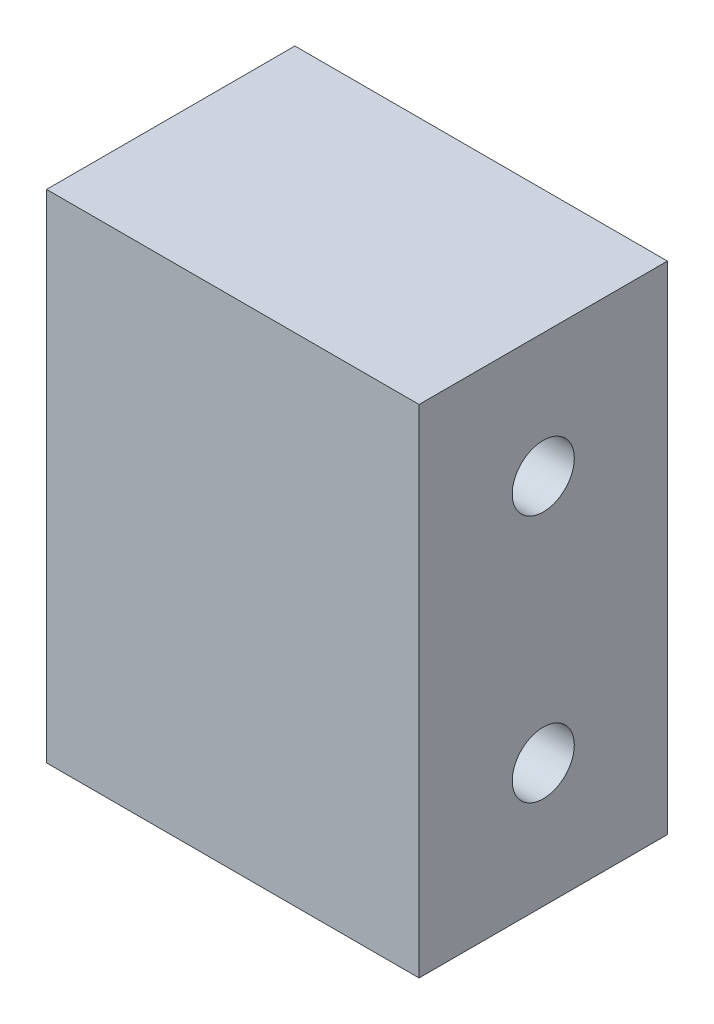
ISO-10303-21;
HEADER;
FILE_DESCRIPTION(('STEP AP214'),'2;1');
FILE_NAME('part.step','',(''),(''),'','','');
FILE_SCHEMA(('AUTOMOTIVE_DESIGN { 1 0 10303 214 1 1 1 1 }'));
ENDSEC;
DATA;
#1=APPLICATION_CONTEXT('core data for automotive mechanical design processes');
#2=APPLICATION_PROTOCOL_DEFINITION('international standard','automotive_design',2000,#1);
#3=PRODUCT_CONTEXT('',#1,'mechanical');
#4=PRODUCT('Part','Part','',(#3));
#5=PRODUCT_RELATED_PRODUCT_CATEGORY('part','',(#4));
#6=PRODUCT_DEFINITION_FORMATION('','',#4);
#7=PRODUCT_DEFINITION_CONTEXT('part definition',#1,'design');
#8=PRODUCT_DEFINITION('design','',#6,#7);
#9=PRODUCT_DEFINITION_SHAPE('','',#8);
#10=(LENGTH_UNIT() NAMED_UNIT(*) SI_UNIT(.MILLI.,.METRE.));
#11=(NAMED_UNIT(*) PLANE_ANGLE_UNIT() SI_UNIT($,.RADIAN.));
#12=(NAMED_UNIT(*) SI_UNIT($,.STERADIAN.) SOLID_ANGLE_UNIT());
#13=UNCERTAINTY_MEASURE_WITH_UNIT(LENGTH_MEASURE(1.E-05),#10,'distance_accuracy_value','');
#14=(GEOMETRIC_REPRESENTATION_CONTEXT(3) GLOBAL_UNCERTAINTY_ASSIGNED_CONTEXT((#13)) GLOBAL_UNIT_ASSIGNED_CONTEXT((#10,
#11,#12)) REPRESENTATION_CONTEXT('',''));
#15=CARTESIAN_POINT('',(0.,0.,0.));
#16=DIRECTION('',(0.,0.,1.));
#17=DIRECTION('',(1.,0.,0.));
#18=AXIS2_PLACEMENT_3D('',#15,#16,#17);
#19=CARTESIAN_POINT('',(60.,0.,0.));
#20=DIRECTION('',(-1.,0.,0.));
#21=DIRECTION('',(0.,0.,1.));
#22=AXIS2_PLACEMENT_3D('',#19,#20,#21);
#23=PLANE('',#22);
#24=DIRECTION('',(0.,-1.,0.));
#25=VECTOR('',#24,1.);
#26=CARTESIAN_POINT('',(60.,0.,0.));
#27=LINE('',#26,#25);
#28=CARTESIAN_POINT('',(60.,80.,0.));
#29=VERTEX_POINT('',#28);
#30=CARTESIAN_POINT('',(60.,0.,0.));
#31=VERTEX_POINT('',#30);
#32=EDGE_CURVE('E97',#29,#31,#27,.T.);
#33=ORIENTED_EDGE('',*,*,#32,.T.);
#34=DIRECTION('',(0.,0.,-1.));
#35=VECTOR('',#34,1.);
#36=CARTESIAN_POINT('',(60.,0.,0.));
#37=LINE('',#36,#35);
#38=CARTESIAN_POINT('',(60.,0.,-40.));
#39=VERTEX_POINT('',#38);
#40=EDGE_CURVE('E92',#31,#39,#37,.T.);
#41=ORIENTED_EDGE('',*,*,#40,.T.);
#42=DIRECTION('',(0.,1.,0.));
#43=VECTOR('',#42,1.);
#44=CARTESIAN_POINT('',(60.,0.,-40.));
#45=LINE('',#44,#43);
#46=CARTESIAN_POINT('',(60.,80.,-40.));
#47=VERTEX_POINT('',#46);
#48=EDGE_CURVE('E95',#39,#47,#45,.T.);
#49=ORIENTED_EDGE('',*,*,#48,.T.);
#50=DIRECTION('',(0.,0.,1.));
#51=VECTOR('',#50,1.);
#52=CARTESIAN_POINT('',(60.,80.,0.));
#53=LINE('',#52,#51);
#54=EDGE_CURVE('E62',#47,#29,#53,.T.);
#55=ORIENTED_EDGE('',*,*,#54,.T.);
#56=EDGE_LOOP('',(#33,#41,#49,#55));
#57=FACE_BOUND('',#56,.T.);
#58=CARTESIAN_POINT('',(60.,60.,-20.));
#59=DIRECTION('',(1.,0.,0.));
#60=DIRECTION('',(0.,0.,-1.));
#61=AXIS2_PLACEMENT_3D('',#58,#59,#60);
#62=CIRCLE('',#61,5.);
#63=CARTESIAN_POINT('',(60.,60.,-25.));
#64=VERTEX_POINT('',#63);
#65=EDGE_CURVE('E112',#64,#64,#62,.T.);
#66=ORIENTED_EDGE('',*,*,#65,.F.);
#67=EDGE_LOOP('',(#66));
#68=FACE_BOUND('',#67,.T.);
#69=CARTESIAN_POINT('',(60.,20.,-20.));
#70=DIRECTION('',(1.,0.,0.));
#71=DIRECTION('',(0.,0.,-1.));
#72=AXIS2_PLACEMENT_3D('',#69,#70,#71);
#73=CIRCLE('',#72,5.);
#74=CARTESIAN_POINT('',(60.,20.,-25.));
#75=VERTEX_POINT('',#74);
#76=EDGE_CURVE('E127',#75,#75,#73,.T.);
#77=ORIENTED_EDGE('',*,*,#76,.F.);
#78=EDGE_LOOP('',(#77));
#79=FACE_BOUND('',#78,.T.);
#80=ADVANCED_FACE('F45',(#57,#68,#79),#23,.F.);
#81=CARTESIAN_POINT('',(0.,0.,0.));
#82=DIRECTION('',(-1.,0.,0.));
#83=DIRECTION('',(0.,0.,1.));
#84=AXIS2_PLACEMENT_3D('',#81,#82,#83);
#85=PLANE('',#84);
#86=CARTESIAN_POINT('',(0.,60.,-20.));
#87=DIRECTION('',(1.,0.,0.));
#88=DIRECTION('',(0.,0.,-1.));
#89=AXIS2_PLACEMENT_3D('',#86,#87,#88);
#90=CIRCLE('',#89,5.);
#91=CARTESIAN_POINT('',(0.,60.,-25.));
#92=VERTEX_POINT('',#91);
#93=EDGE_CURVE('E124',#92,#92,#90,.T.);
#94=ORIENTED_EDGE('',*,*,#93,.T.);
#95=EDGE_LOOP('',(#94));
#96=FACE_BOUND('',#95,.T.);
#97=DIRECTION('',(0.,-1.,0.));
#98=VECTOR('',#97,1.);
#99=CARTESIAN_POINT('',(0.,0.,0.));
#100=LINE('',#99,#98);
#101=CARTESIAN_POINT('',(0.,80.,0.));
#102=VERTEX_POINT('',#101);
#103=CARTESIAN_POINT('',(0.,0.,0.));
#104=VERTEX_POINT('',#103);
#105=EDGE_CURVE('E109',#102,#104,#100,.T.);
#106=ORIENTED_EDGE('',*,*,#105,.F.);
#107=DIRECTION('',(0.,0.,1.));
#108=VECTOR('',#107,1.);
#109=CARTESIAN_POINT('',(0.,80.,0.));
#110=LINE('',#109,#108);
#111=CARTESIAN_POINT('',(0.,80.,-40.));
#112=VERTEX_POINT('',#111);
#113=EDGE_CURVE('E85',#112,#102,#110,.T.);
#114=ORIENTED_EDGE('',*,*,#113,.F.);
#115=DIRECTION('',(0.,1.,0.));
#116=VECTOR('',#115,1.);
#117=CARTESIAN_POINT('',(0.,0.,-40.));
#118=LINE('',#117,#116);
#119=CARTESIAN_POINT('',(0.,0.,-40.));
#120=VERTEX_POINT('',#119);
#121=EDGE_CURVE('E79',#120,#112,#118,.T.);
#122=ORIENTED_EDGE('',*,*,#121,.F.);
#123=DIRECTION('',(0.,0.,-1.));
#124=VECTOR('',#123,1.);
#125=CARTESIAN_POINT('',(0.,0.,0.));
#126=LINE('',#125,#124);
#127=EDGE_CURVE('E101',#104,#120,#126,.T.);
#128=ORIENTED_EDGE('',*,*,#127,.F.);
#129=EDGE_LOOP('',(#106,#114,#122,#128));
#130=FACE_BOUND('',#129,.T.);
#131=CARTESIAN_POINT('',(0.,20.,-20.));
#132=DIRECTION('',(1.,0.,0.));
#133=DIRECTION('',(0.,0.,-1.));
#134=AXIS2_PLACEMENT_3D('',#131,#132,#133);
#135=CIRCLE('',#134,5.);
#136=CARTESIAN_POINT('',(0.,20.,-25.));
#137=VERTEX_POINT('',#136);
#138=EDGE_CURVE('E130',#137,#137,#135,.T.);
#139=ORIENTED_EDGE('',*,*,#138,.T.);
#140=EDGE_LOOP('',(#139));
#141=FACE_BOUND('',#140,.T.);
#142=ADVANCED_FACE('F120',(#96,#130,#141),#85,.T.);
#143=CARTESIAN_POINT('',(60.,0.,0.));
#144=DIRECTION('',(0.,0.,-1.));
#145=DIRECTION('',(-1.,0.,0.));
#146=AXIS2_PLACEMENT_3D('',#143,#144,#145);
#147=PLANE('',#146);
#148=ORIENTED_EDGE('',*,*,#105,.T.);
#149=DIRECTION('',(-1.,0.,0.));
#150=VECTOR('',#149,1.);
#151=CARTESIAN_POINT('',(60.,0.,0.));
#152=LINE('',#151,#150);
#153=EDGE_CURVE('E13',#31,#104,#152,.T.);
#154=ORIENTED_EDGE('',*,*,#153,.F.);
#155=ORIENTED_EDGE('',*,*,#32,.F.);
#156=DIRECTION('',(-1.,0.,0.));
#157=VECTOR('',#156,1.);
#158=CARTESIAN_POINT('',(60.,80.,0.));
#159=LINE('',#158,#157);
#160=EDGE_CURVE('E105',#29,#102,#159,.T.);
#161=ORIENTED_EDGE('',*,*,#160,.T.);
#162=EDGE_LOOP('',(#148,#154,#155,#161));
#163=FACE_BOUND('',#162,.T.);
#164=ADVANCED_FACE('F47',(#163),#147,.F.);
#165=CARTESIAN_POINT('',(60.,0.,0.));
#166=DIRECTION('',(0.,1.,0.));
#167=DIRECTION('',(0.,0.,1.));
#168=AXIS2_PLACEMENT_3D('',#165,#166,#167);
#169=PLANE('',#168);
#170=ORIENTED_EDGE('',*,*,#127,.T.);
#171=DIRECTION('',(-1.,0.,0.));
#172=VECTOR('',#171,1.);
#173=CARTESIAN_POINT('',(60.,0.,-40.));
#174=LINE('',#173,#172);
#175=EDGE_CURVE('E54',#39,#120,#174,.T.);
#176=ORIENTED_EDGE('',*,*,#175,.F.);
#177=ORIENTED_EDGE('',*,*,#40,.F.);
#178=ORIENTED_EDGE('',*,*,#153,.T.);
#179=EDGE_LOOP('',(#170,#176,#177,#178));
#180=FACE_BOUND('',#179,.T.);
#181=ADVANCED_FACE('F100',(#180),#169,.F.);
#182=CARTESIAN_POINT('',(60.,0.,-40.));
#183=DIRECTION('',(0.,0.,1.));
#184=DIRECTION('',(1.,0.,0.));
#185=AXIS2_PLACEMENT_3D('',#182,#183,#184);
#186=PLANE('',#185);
#187=ORIENTED_EDGE('',*,*,#121,.T.);
#188=DIRECTION('',(-1.,0.,0.));
#189=VECTOR('',#188,1.);
#190=CARTESIAN_POINT('',(60.,80.,-40.));
#191=LINE('',#190,#189);
#192=EDGE_CURVE('E102',#47,#112,#191,.T.);
#193=ORIENTED_EDGE('',*,*,#192,.F.);
#194=ORIENTED_EDGE('',*,*,#48,.F.);
#195=ORIENTED_EDGE('',*,*,#175,.T.);
#196=EDGE_LOOP('',(#187,#193,#194,#195));
#197=FACE_BOUND('',#196,.T.);
#198=ADVANCED_FACE('F103',(#197),#186,.F.);
#199=CARTESIAN_POINT('',(60.,80.,0.));
#200=DIRECTION('',(0.,-1.,0.));
#201=DIRECTION('',(0.,0.,-1.));
#202=AXIS2_PLACEMENT_3D('',#199,#200,#201);
#203=PLANE('',#202);
#204=ORIENTED_EDGE('',*,*,#113,.T.);
#205=ORIENTED_EDGE('',*,*,#160,.F.);
#206=ORIENTED_EDGE('',*,*,#54,.F.);
#207=ORIENTED_EDGE('',*,*,#192,.T.);
#208=EDGE_LOOP('',(#204,#205,#206,#207));
#209=FACE_BOUND('',#208,.T.);
#210=ADVANCED_FACE('F117',(#209),#203,.F.);
#211=CARTESIAN_POINT('',(60.,60.,-20.));
#212=DIRECTION('',(-1.,0.,0.));
#213=DIRECTION('',(0.,0.,1.));
#214=AXIS2_PLACEMENT_3D('',#211,#212,#213);
#215=CYLINDRICAL_SURFACE('',#214,5.);
#216=ORIENTED_EDGE('',*,*,#65,.T.);
#217=EDGE_LOOP('',(#216));
#218=FACE_BOUND('',#217,.T.);
#219=ORIENTED_EDGE('',*,*,#93,.F.);
#220=EDGE_LOOP('',(#219));
#221=FACE_BOUND('',#220,.T.);
#222=ADVANCED_FACE('F147',(#218,#221),#215,.F.);
#223=CARTESIAN_POINT('',(60.,20.,-20.));
#224=DIRECTION('',(-1.,0.,0.));
#225=DIRECTION('',(0.,0.,1.));
#226=AXIS2_PLACEMENT_3D('',#223,#224,#225);
#227=CYLINDRICAL_SURFACE('',#226,5.);
#228=ORIENTED_EDGE('',*,*,#76,.T.);
#229=EDGE_LOOP('',(#228));
#230=FACE_BOUND('',#229,.T.);
#231=ORIENTED_EDGE('',*,*,#138,.F.);
#232=EDGE_LOOP('',(#231));
#233=FACE_BOUND('',#232,.T.);
#234=ADVANCED_FACE('F136',(#230,#233),#227,.F.);
#235=CLOSED_SHELL('',(#80,#142,#164,#181,#198,#210,#222,#234));
#236=MANIFOLD_SOLID_BREP('B2',#235);
#237=ADVANCED_BREP_SHAPE_REPRESENTATION('',(#18,#236),#14);
#238=SHAPE_DEFINITION_REPRESENTATION(#9,#237);
ENDSEC;
END-ISO-10303-21;
